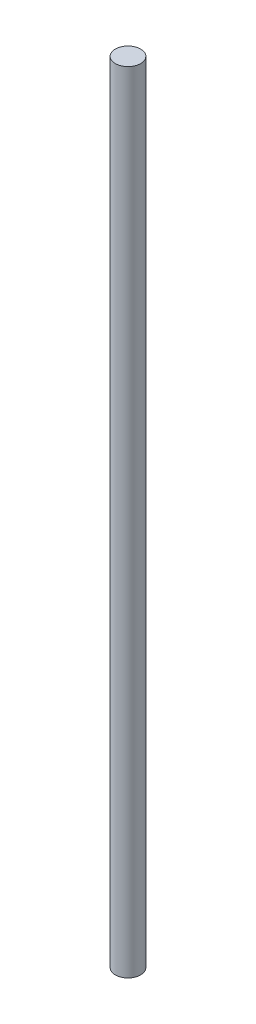
ISO-10303-21;
HEADER;
FILE_DESCRIPTION(('STEP AP214'),'2;1');
FILE_NAME('part.step','',(''),(''),'','','');
FILE_SCHEMA(('AUTOMOTIVE_DESIGN { 1 0 10303 214 1 1 1 1 }'));
ENDSEC;
DATA;
#1=APPLICATION_CONTEXT('core data for automotive mechanical design processes');
#2=APPLICATION_PROTOCOL_DEFINITION('international standard','automotive_design',2000,#1);
#3=PRODUCT_CONTEXT('',#1,'mechanical');
#4=PRODUCT('Part','Part','',(#3));
#5=PRODUCT_RELATED_PRODUCT_CATEGORY('part','',(#4));
#6=PRODUCT_DEFINITION_FORMATION('','',#4);
#7=PRODUCT_DEFINITION_CONTEXT('part definition',#1,'design');
#8=PRODUCT_DEFINITION('design','',#6,#7);
#9=PRODUCT_DEFINITION_SHAPE('','',#8);
#10=(LENGTH_UNIT() NAMED_UNIT(*) SI_UNIT(.MILLI.,.METRE.));
#11=(NAMED_UNIT(*) PLANE_ANGLE_UNIT() SI_UNIT($,.RADIAN.));
#12=(NAMED_UNIT(*) SI_UNIT($,.STERADIAN.) SOLID_ANGLE_UNIT());
#13=UNCERTAINTY_MEASURE_WITH_UNIT(LENGTH_MEASURE(1.E-05),#10,'distance_accuracy_value','');
#14=(GEOMETRIC_REPRESENTATION_CONTEXT(3) GLOBAL_UNCERTAINTY_ASSIGNED_CONTEXT((#13)) GLOBAL_UNIT_ASSIGNED_CONTEXT((#10,
#11,#12)) REPRESENTATION_CONTEXT('',''));
#15=CARTESIAN_POINT('',(0.,0.,0.));
#16=DIRECTION('',(0.,0.,1.));
#17=DIRECTION('',(1.,0.,0.));
#18=AXIS2_PLACEMENT_3D('',#15,#16,#17);
#19=CARTESIAN_POINT('',(0.,250.,0.));
#20=DIRECTION('',(0.,-1.,0.));
#21=DIRECTION('',(0.,0.,-1.));
#22=AXIS2_PLACEMENT_3D('',#19,#20,#21);
#23=CYLINDRICAL_SURFACE('',#22,4.);
#24=CARTESIAN_POINT('',(0.,250.,0.));
#25=DIRECTION('',(0.,1.,0.));
#26=DIRECTION('',(0.,0.,1.));
#27=AXIS2_PLACEMENT_3D('',#24,#25,#26);
#28=CIRCLE('',#27,4.);
#29=CARTESIAN_POINT('',(0.,250.,4.));
#30=VERTEX_POINT('',#29);
#31=EDGE_CURVE('E10',#30,#30,#28,.T.);
#32=ORIENTED_EDGE('',*,*,#31,.F.);
#33=EDGE_LOOP('',(#32));
#34=FACE_BOUND('',#33,.T.);
#35=CARTESIAN_POINT('',(0.,0.,0.));
#36=DIRECTION('',(0.,1.,0.));
#37=DIRECTION('',(0.,0.,1.));
#38=AXIS2_PLACEMENT_3D('',#35,#36,#37);
#39=CIRCLE('',#38,4.);
#40=CARTESIAN_POINT('',(0.,0.,4.));
#41=VERTEX_POINT('',#40);
#42=EDGE_CURVE('E34',#41,#41,#39,.T.);
#43=ORIENTED_EDGE('',*,*,#42,.T.);
#44=EDGE_LOOP('',(#43));
#45=FACE_BOUND('',#44,.T.);
#46=ADVANCED_FACE('F31',(#34,#45),#23,.T.);
#47=CARTESIAN_POINT('',(0.,250.,0.));
#48=DIRECTION('',(0.,1.,0.));
#49=DIRECTION('',(0.,0.,1.));
#50=AXIS2_PLACEMENT_3D('',#47,#48,#49);
#51=PLANE('',#50);
#52=ORIENTED_EDGE('',*,*,#31,.T.);
#53=EDGE_LOOP('',(#52));
#54=FACE_BOUND('',#53,.T.);
#55=ADVANCED_FACE('F46',(#54),#51,.T.);
#56=CARTESIAN_POINT('',(0.,0.,0.));
#57=DIRECTION('',(0.,1.,0.));
#58=DIRECTION('',(0.,0.,1.));
#59=AXIS2_PLACEMENT_3D('',#56,#57,#58);
#60=PLANE('',#59);
#61=ORIENTED_EDGE('',*,*,#42,.F.);
#62=EDGE_LOOP('',(#61));
#63=FACE_BOUND('',#62,.T.);
#64=ADVANCED_FACE('F44',(#63),#60,.F.);
#65=CLOSED_SHELL('',(#46,#55,#64));
#66=MANIFOLD_SOLID_BREP('B2',#65);
#67=ADVANCED_BREP_SHAPE_REPRESENTATION('',(#18,#66),#14);
#68=SHAPE_DEFINITION_REPRESENTATION(#9,#67);
ENDSEC;
END-ISO-10303-21;
